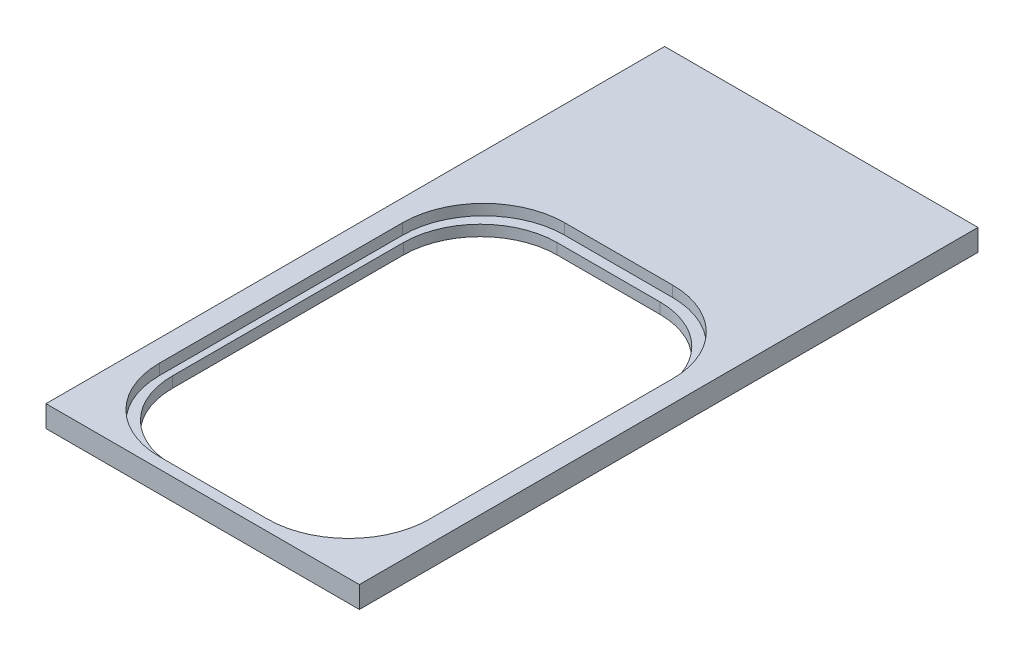
ISO-10303-21;
HEADER;
FILE_DESCRIPTION(('STEP AP214'),'2;1');
FILE_NAME('part.step','',(''),(''),'','','');
FILE_SCHEMA(('AUTOMOTIVE_DESIGN { 1 0 10303 214 1 1 1 1 }'));
ENDSEC;
DATA;
#1=APPLICATION_CONTEXT('core data for automotive mechanical design processes');
#2=APPLICATION_PROTOCOL_DEFINITION('international standard','automotive_design',2000,#1);
#3=PRODUCT_CONTEXT('',#1,'mechanical');
#4=PRODUCT('Part','Part','',(#3));
#5=PRODUCT_RELATED_PRODUCT_CATEGORY('part','',(#4));
#6=PRODUCT_DEFINITION_FORMATION('','',#4);
#7=PRODUCT_DEFINITION_CONTEXT('part definition',#1,'design');
#8=PRODUCT_DEFINITION('design','',#6,#7);
#9=PRODUCT_DEFINITION_SHAPE('','',#8);
#10=(LENGTH_UNIT() NAMED_UNIT(*) SI_UNIT(.MILLI.,.METRE.));
#11=(NAMED_UNIT(*) PLANE_ANGLE_UNIT() SI_UNIT($,.RADIAN.));
#12=(NAMED_UNIT(*) SI_UNIT($,.STERADIAN.) SOLID_ANGLE_UNIT());
#13=UNCERTAINTY_MEASURE_WITH_UNIT(LENGTH_MEASURE(1.E-05),#10,'distance_accuracy_value','');
#14=(GEOMETRIC_REPRESENTATION_CONTEXT(3) GLOBAL_UNCERTAINTY_ASSIGNED_CONTEXT((#13)) GLOBAL_UNIT_ASSIGNED_CONTEXT((#10,
#11,#12)) REPRESENTATION_CONTEXT('',''));
#15=CARTESIAN_POINT('',(0.,0.,0.));
#16=DIRECTION('',(0.,0.,1.));
#17=DIRECTION('',(1.,0.,0.));
#18=AXIS2_PLACEMENT_3D('',#15,#16,#17);
#19=CARTESIAN_POINT('',(-66.6066908635703,4.,36.3519764590724));
#20=DIRECTION('',(0.,0.,1.));
#21=DIRECTION('',(1.,0.,0.));
#22=AXIS2_PLACEMENT_3D('',#19,#20,#21);
#23=PLANE('',#22);
#24=DIRECTION('',(0.,-1.,0.));
#25=VECTOR('',#24,1.);
#26=CARTESIAN_POINT('',(-23.1066908635703,0.,36.3519764590724));
#27=LINE('',#26,#25);
#28=CARTESIAN_POINT('',(-23.1066908635703,4.,36.3519764590724));
#29=VERTEX_POINT('',#28);
#30=CARTESIAN_POINT('',(-23.1066908635703,0.,36.3519764590724));
#31=VERTEX_POINT('',#30);
#32=EDGE_CURVE('E185',#29,#31,#27,.T.);
#33=ORIENTED_EDGE('',*,*,#32,.F.);
#34=DIRECTION('',(1.,0.,0.));
#35=VECTOR('',#34,1.);
#36=CARTESIAN_POINT('',(0.,4.,36.3519764590724));
#37=LINE('',#36,#35);
#38=CARTESIAN_POINT('',(-81.1066908635703,4.,36.3519764590724));
#39=VERTEX_POINT('',#38);
#40=EDGE_CURVE('E173',#39,#29,#37,.T.);
#41=ORIENTED_EDGE('',*,*,#40,.F.);
#42=DIRECTION('',(0.,1.,0.));
#43=VECTOR('',#42,1.);
#44=CARTESIAN_POINT('',(-81.1066908635703,0.,36.3519764590724));
#45=LINE('',#44,#43);
#46=CARTESIAN_POINT('',(-81.1066908635703,0.,36.3519764590724));
#47=VERTEX_POINT('',#46);
#48=EDGE_CURVE('E182',#47,#39,#45,.T.);
#49=ORIENTED_EDGE('',*,*,#48,.F.);
#50=DIRECTION('',(1.,0.,0.));
#51=VECTOR('',#50,1.);
#52=CARTESIAN_POINT('',(0.,0.,36.3519764590724));
#53=LINE('',#52,#51);
#54=EDGE_CURVE('E187',#47,#31,#53,.T.);
#55=ORIENTED_EDGE('',*,*,#54,.T.);
#56=EDGE_LOOP('',(#33,#41,#49,#55));
#57=FACE_BOUND('',#56,.T.);
#58=ADVANCED_FACE('F37',(#57),#23,.T.);
#59=CARTESIAN_POINT('',(-62.1066908635703,2.,-25.6480235409276));
#60=DIRECTION('',(0.,-1.,0.));
#61=DIRECTION('',(0.,0.,-1.));
#62=AXIS2_PLACEMENT_3D('',#59,#60,#61);
#63=PLANE('',#62);
#64=CARTESIAN_POINT('',(-62.1066908635703,2.,-25.6480235409276));
#65=DIRECTION('',(0.,-1.,0.));
#66=DIRECTION('',(0.,0.,-1.));
#67=AXIS2_PLACEMENT_3D('',#64,#65,#66);
#68=CIRCLE('',#67,15.);
#69=CARTESIAN_POINT('',(-77.1066908635703,2.,-25.6480235409276));
#70=VERTEX_POINT('',#69);
#71=CARTESIAN_POINT('',(-62.1066908635703,2.,-40.6480235409276));
#72=VERTEX_POINT('',#71);
#73=EDGE_CURVE('E265',#70,#72,#68,.T.);
#74=ORIENTED_EDGE('',*,*,#73,.F.);
#75=DIRECTION('',(0.,0.,-1.));
#76=VECTOR('',#75,1.);
#77=CARTESIAN_POINT('',(-77.1066908635703,2.,19.3519764590724));
#78=LINE('',#77,#76);
#79=CARTESIAN_POINT('',(-77.1066908635703,2.,19.3519764590724));
#80=VERTEX_POINT('',#79);
#81=EDGE_CURVE('E281',#80,#70,#78,.T.);
#82=ORIENTED_EDGE('',*,*,#81,.F.);
#83=CARTESIAN_POINT('',(-62.1066908635703,2.,19.3519764590724));
#84=DIRECTION('',(0.,-1.,0.));
#85=DIRECTION('',(0.,0.,-1.));
#86=AXIS2_PLACEMENT_3D('',#83,#84,#85);
#87=CIRCLE('',#86,15.);
#88=CARTESIAN_POINT('',(-62.1066908635703,2.,34.3519764590724));
#89=VERTEX_POINT('',#88);
#90=EDGE_CURVE('E279',#89,#80,#87,.T.);
#91=ORIENTED_EDGE('',*,*,#90,.F.);
#92=DIRECTION('',(-1.,0.,0.));
#93=VECTOR('',#92,1.);
#94=CARTESIAN_POINT('',(-42.1066908635703,2.,34.3519764590724));
#95=LINE('',#94,#93);
#96=CARTESIAN_POINT('',(-42.1066908635703,2.,34.3519764590724));
#97=VERTEX_POINT('',#96);
#98=EDGE_CURVE('E277',#97,#89,#95,.T.);
#99=ORIENTED_EDGE('',*,*,#98,.F.);
#100=CARTESIAN_POINT('',(-42.1066908635703,2.,19.3519764590724));
#101=DIRECTION('',(0.,-1.,0.));
#102=DIRECTION('',(0.,0.,-1.));
#103=AXIS2_PLACEMENT_3D('',#100,#101,#102);
#104=CIRCLE('',#103,15.);
#105=CARTESIAN_POINT('',(-27.1066908635703,2.,19.3519764590724));
#106=VERTEX_POINT('',#105);
#107=EDGE_CURVE('E275',#106,#97,#104,.T.);
#108=ORIENTED_EDGE('',*,*,#107,.F.);
#109=DIRECTION('',(0.,0.,1.));
#110=VECTOR('',#109,1.);
#111=CARTESIAN_POINT('',(-27.1066908635703,2.,-25.6480235409276));
#112=LINE('',#111,#110);
#113=CARTESIAN_POINT('',(-27.1066908635703,2.,-25.6480235409276));
#114=VERTEX_POINT('',#113);
#115=EDGE_CURVE('E273',#114,#106,#112,.T.);
#116=ORIENTED_EDGE('',*,*,#115,.F.);
#117=CARTESIAN_POINT('',(-42.1066908635703,2.,-25.6480235409276));
#118=DIRECTION('',(0.,-1.,0.));
#119=DIRECTION('',(0.,0.,-1.));
#120=AXIS2_PLACEMENT_3D('',#117,#118,#119);
#121=CIRCLE('',#120,15.);
#122=CARTESIAN_POINT('',(-42.1066908635703,2.,-40.6480235409276));
#123=VERTEX_POINT('',#122);
#124=EDGE_CURVE('E271',#123,#114,#121,.T.);
#125=ORIENTED_EDGE('',*,*,#124,.F.);
#126=DIRECTION('',(1.,0.,0.));
#127=VECTOR('',#126,1.);
#128=CARTESIAN_POINT('',(-62.1066908635703,2.,-40.6480235409276));
#129=LINE('',#128,#127);
#130=EDGE_CURVE('E268',#72,#123,#129,.T.);
#131=ORIENTED_EDGE('',*,*,#130,.F.);
#132=EDGE_LOOP('',(#74,#82,#91,#99,#108,#116,#125,#131));
#133=FACE_BOUND('',#132,.T.);
#134=CARTESIAN_POINT('',(-61.6066904253846,2.,-24.5230235409276));
#135=DIRECTION('',(0.,-1.,0.));
#136=DIRECTION('',(0.,0.,-1.));
#137=AXIS2_PLACEMENT_3D('',#134,#135,#136);
#138=CIRCLE('',#137,14.25);
#139=CARTESIAN_POINT('',(-61.6066904253846,2.,-38.7730235409276));
#140=VERTEX_POINT('',#139);
#141=CARTESIAN_POINT('',(-75.8566904253846,2.,-24.5230235409276));
#142=VERTEX_POINT('',#141);
#143=EDGE_CURVE('E198',#140,#142,#138,.F.);
#144=ORIENTED_EDGE('',*,*,#143,.F.);
#145=DIRECTION('',(-1.,0.,0.));
#146=VECTOR('',#145,1.);
#147=CARTESIAN_POINT('',(-62.1066908635703,2.,-38.7730235409276));
#148=LINE('',#147,#146);
#149=CARTESIAN_POINT('',(-42.6066904253846,2.,-38.7730235409276));
#150=VERTEX_POINT('',#149);
#151=EDGE_CURVE('E201',#150,#140,#148,.T.);
#152=ORIENTED_EDGE('',*,*,#151,.F.);
#153=CARTESIAN_POINT('',(-42.6066904253846,2.,-24.5230235409276));
#154=DIRECTION('',(0.,-1.,0.));
#155=DIRECTION('',(0.,0.,-1.));
#156=AXIS2_PLACEMENT_3D('',#153,#154,#155);
#157=CIRCLE('',#156,14.25);
#158=CARTESIAN_POINT('',(-28.3566904253846,2.,-24.5230235409276));
#159=VERTEX_POINT('',#158);
#160=EDGE_CURVE('E208',#159,#150,#157,.F.);
#161=ORIENTED_EDGE('',*,*,#160,.F.);
#162=DIRECTION('',(0.,0.,-1.));
#163=VECTOR('',#162,1.);
#164=CARTESIAN_POINT('',(-28.3566904253846,2.,-25.6480235409276));
#165=LINE('',#164,#163);
#166=CARTESIAN_POINT('',(-28.3566904253846,2.,18.2269764590724));
#167=VERTEX_POINT('',#166);
#168=EDGE_CURVE('E326',#167,#159,#165,.T.);
#169=ORIENTED_EDGE('',*,*,#168,.F.);
#170=CARTESIAN_POINT('',(-42.6066904253846,2.,18.2269764590724));
#171=DIRECTION('',(0.,-1.,0.));
#172=DIRECTION('',(0.,0.,-1.));
#173=AXIS2_PLACEMENT_3D('',#170,#171,#172);
#174=CIRCLE('',#173,14.25);
#175=CARTESIAN_POINT('',(-42.6066904253846,2.,32.4769764590724));
#176=VERTEX_POINT('',#175);
#177=EDGE_CURVE('E324',#176,#167,#174,.F.);
#178=ORIENTED_EDGE('',*,*,#177,.F.);
#179=DIRECTION('',(1.,0.,0.));
#180=VECTOR('',#179,1.);
#181=CARTESIAN_POINT('',(-62.1066908635703,2.,32.4769764590724));
#182=LINE('',#181,#180);
#183=CARTESIAN_POINT('',(-61.6066904253846,2.,32.4769764590724));
#184=VERTEX_POINT('',#183);
#185=EDGE_CURVE('E322',#184,#176,#182,.T.);
#186=ORIENTED_EDGE('',*,*,#185,.F.);
#187=CARTESIAN_POINT('',(-61.6066904253846,2.,18.2269764590724));
#188=DIRECTION('',(0.,-1.,0.));
#189=DIRECTION('',(0.,0.,-1.));
#190=AXIS2_PLACEMENT_3D('',#187,#188,#189);
#191=CIRCLE('',#190,14.25);
#192=CARTESIAN_POINT('',(-75.8566904253846,2.,18.2269764590724));
#193=VERTEX_POINT('',#192);
#194=EDGE_CURVE('E320',#193,#184,#191,.F.);
#195=ORIENTED_EDGE('',*,*,#194,.F.);
#196=DIRECTION('',(0.,0.,1.));
#197=VECTOR('',#196,1.);
#198=CARTESIAN_POINT('',(-75.8566904253846,2.,-25.6480235409276));
#199=LINE('',#198,#197);
#200=EDGE_CURVE('E222',#142,#193,#199,.T.);
#201=ORIENTED_EDGE('',*,*,#200,.F.);
#202=EDGE_LOOP('',(#144,#152,#161,#169,#178,#186,#195,#201));
#203=FACE_BOUND('',#202,.T.);
#204=ADVANCED_FACE('F340',(#133,#203),#63,.F.);
#205=CARTESIAN_POINT('',(-61.6066904253846,-13.9294528165414,-38.7730235409276));
#206=DIRECTION('',(0.,0.,1.));
#207=DIRECTION('',(1.,0.,0.));
#208=AXIS2_PLACEMENT_3D('',#205,#206,#207);
#209=PLANE('',#208);
#210=DIRECTION('',(1.,0.,0.));
#211=VECTOR('',#210,1.);
#212=CARTESIAN_POINT('',(0.,0.,-38.7730235409276));
#213=LINE('',#212,#211);
#214=CARTESIAN_POINT('',(-61.6066904253846,0.,-38.7730235409276));
#215=VERTEX_POINT('',#214);
#216=CARTESIAN_POINT('',(-42.6066904253846,0.,-38.7730235409276));
#217=VERTEX_POINT('',#216);
#218=EDGE_CURVE('E260',#215,#217,#213,.T.);
#219=ORIENTED_EDGE('',*,*,#218,.T.);
#220=DIRECTION('',(0.,1.,0.));
#221=VECTOR('',#220,1.);
#222=CARTESIAN_POINT('',(-42.6066904253846,-13.9294528165414,-38.7730235409276));
#223=LINE('',#222,#221);
#224=EDGE_CURVE('E242',#217,#150,#223,.T.);
#225=ORIENTED_EDGE('',*,*,#224,.T.);
#226=ORIENTED_EDGE('',*,*,#151,.T.);
#227=DIRECTION('',(0.,1.,0.));
#228=VECTOR('',#227,1.);
#229=CARTESIAN_POINT('',(-61.6066904253846,-13.9294528165414,-38.7730235409276));
#230=LINE('',#229,#228);
#231=EDGE_CURVE('E245',#215,#140,#230,.T.);
#232=ORIENTED_EDGE('',*,*,#231,.F.);
#233=EDGE_LOOP('',(#219,#225,#226,#232));
#234=FACE_BOUND('',#233,.T.);
#235=ADVANCED_FACE('F337',(#234),#209,.T.);
#236=CARTESIAN_POINT('',(-42.6066904253846,-13.9294528165414,-24.5230235409276));
#237=DIRECTION('',(0.,1.,0.));
#238=DIRECTION('',(0.,0.,1.));
#239=AXIS2_PLACEMENT_3D('',#236,#237,#238);
#240=CYLINDRICAL_SURFACE('',#239,14.25);
#241=CARTESIAN_POINT('',(-42.6066904253846,0.,-24.5230235409276));
#242=DIRECTION('',(0.,1.,0.));
#243=DIRECTION('',(0.,0.,1.));
#244=AXIS2_PLACEMENT_3D('',#241,#242,#243);
#245=CIRCLE('',#244,14.25);
#246=CARTESIAN_POINT('',(-28.3566904253846,0.,-24.5230235409276));
#247=VERTEX_POINT('',#246);
#248=EDGE_CURVE('E258',#217,#247,#245,.F.);
#249=ORIENTED_EDGE('',*,*,#248,.T.);
#250=DIRECTION('',(0.,1.,0.));
#251=VECTOR('',#250,1.);
#252=CARTESIAN_POINT('',(-28.3566904253846,-13.9294528165414,-24.5230235409276));
#253=LINE('',#252,#251);
#254=EDGE_CURVE('E239',#247,#159,#253,.T.);
#255=ORIENTED_EDGE('',*,*,#254,.T.);
#256=ORIENTED_EDGE('',*,*,#160,.T.);
#257=ORIENTED_EDGE('',*,*,#224,.F.);
#258=EDGE_LOOP('',(#249,#255,#256,#257));
#259=FACE_BOUND('',#258,.T.);
#260=ADVANCED_FACE('F330',(#259),#240,.F.);
#261=CARTESIAN_POINT('',(-28.3566904253846,-13.9294528165414,-24.5230235409276));
#262=DIRECTION('',(-1.,0.,0.));
#263=DIRECTION('',(0.,0.,1.));
#264=AXIS2_PLACEMENT_3D('',#261,#262,#263);
#265=PLANE('',#264);
#266=DIRECTION('',(0.,0.,1.));
#267=VECTOR('',#266,1.);
#268=CARTESIAN_POINT('',(-28.3566904253846,0.,0.));
#269=LINE('',#268,#267);
#270=CARTESIAN_POINT('',(-28.3566904253846,0.,18.2269764590724));
#271=VERTEX_POINT('',#270);
#272=EDGE_CURVE('E256',#247,#271,#269,.T.);
#273=ORIENTED_EDGE('',*,*,#272,.T.);
#274=DIRECTION('',(0.,1.,0.));
#275=VECTOR('',#274,1.);
#276=CARTESIAN_POINT('',(-28.3566904253846,-13.9294528165414,18.2269764590724));
#277=LINE('',#276,#275);
#278=EDGE_CURVE('E236',#271,#167,#277,.T.);
#279=ORIENTED_EDGE('',*,*,#278,.T.);
#280=ORIENTED_EDGE('',*,*,#168,.T.);
#281=ORIENTED_EDGE('',*,*,#254,.F.);
#282=EDGE_LOOP('',(#273,#279,#280,#281));
#283=FACE_BOUND('',#282,.T.);
#284=ADVANCED_FACE('F357',(#283),#265,.T.);
#285=CARTESIAN_POINT('',(-42.6066904253846,-13.9294528165414,18.2269764590724));
#286=DIRECTION('',(0.,1.,0.));
#287=DIRECTION('',(0.,0.,1.));
#288=AXIS2_PLACEMENT_3D('',#285,#286,#287);
#289=CYLINDRICAL_SURFACE('',#288,14.25);
#290=CARTESIAN_POINT('',(-42.6066904253846,0.,18.2269764590724));
#291=DIRECTION('',(0.,1.,0.));
#292=DIRECTION('',(0.,0.,1.));
#293=AXIS2_PLACEMENT_3D('',#290,#291,#292);
#294=CIRCLE('',#293,14.25);
#295=CARTESIAN_POINT('',(-42.6066904253846,0.,32.4769764590724));
#296=VERTEX_POINT('',#295);
#297=EDGE_CURVE('E254',#271,#296,#294,.F.);
#298=ORIENTED_EDGE('',*,*,#297,.T.);
#299=DIRECTION('',(0.,1.,0.));
#300=VECTOR('',#299,1.);
#301=CARTESIAN_POINT('',(-42.6066904253846,-13.9294528165414,32.4769764590724));
#302=LINE('',#301,#300);
#303=EDGE_CURVE('E233',#296,#176,#302,.T.);
#304=ORIENTED_EDGE('',*,*,#303,.T.);
#305=ORIENTED_EDGE('',*,*,#177,.T.);
#306=ORIENTED_EDGE('',*,*,#278,.F.);
#307=EDGE_LOOP('',(#298,#304,#305,#306));
#308=FACE_BOUND('',#307,.T.);
#309=ADVANCED_FACE('F361',(#308),#289,.F.);
#310=CARTESIAN_POINT('',(-42.6066904253846,-13.9294528165414,32.4769764590724));
#311=DIRECTION('',(0.,0.,-1.));
#312=DIRECTION('',(-1.,0.,0.));
#313=AXIS2_PLACEMENT_3D('',#310,#311,#312);
#314=PLANE('',#313);
#315=DIRECTION('',(-1.,0.,0.));
#316=VECTOR('',#315,1.);
#317=CARTESIAN_POINT('',(0.,0.,32.4769764590724));
#318=LINE('',#317,#316);
#319=CARTESIAN_POINT('',(-61.6066904253846,0.,32.4769764590724));
#320=VERTEX_POINT('',#319);
#321=EDGE_CURVE('E252',#296,#320,#318,.T.);
#322=ORIENTED_EDGE('',*,*,#321,.T.);
#323=DIRECTION('',(0.,1.,0.));
#324=VECTOR('',#323,1.);
#325=CARTESIAN_POINT('',(-61.6066904253846,-13.9294528165414,32.4769764590724));
#326=LINE('',#325,#324);
#327=EDGE_CURVE('E230',#320,#184,#326,.T.);
#328=ORIENTED_EDGE('',*,*,#327,.T.);
#329=ORIENTED_EDGE('',*,*,#185,.T.);
#330=ORIENTED_EDGE('',*,*,#303,.F.);
#331=EDGE_LOOP('',(#322,#328,#329,#330));
#332=FACE_BOUND('',#331,.T.);
#333=ADVANCED_FACE('F364',(#332),#314,.T.);
#334=CARTESIAN_POINT('',(-61.6066904253846,-13.9294528165414,18.2269764590724));
#335=DIRECTION('',(0.,1.,0.));
#336=DIRECTION('',(0.,0.,1.));
#337=AXIS2_PLACEMENT_3D('',#334,#335,#336);
#338=CYLINDRICAL_SURFACE('',#337,14.25);
#339=CARTESIAN_POINT('',(-61.6066904253846,0.,18.2269764590724));
#340=DIRECTION('',(0.,1.,0.));
#341=DIRECTION('',(0.,0.,1.));
#342=AXIS2_PLACEMENT_3D('',#339,#340,#341);
#343=CIRCLE('',#342,14.25);
#344=CARTESIAN_POINT('',(-75.8566904253846,0.,18.2269764590724));
#345=VERTEX_POINT('',#344);
#346=EDGE_CURVE('E249',#320,#345,#343,.F.);
#347=ORIENTED_EDGE('',*,*,#346,.T.);
#348=DIRECTION('',(0.,1.,0.));
#349=VECTOR('',#348,1.);
#350=CARTESIAN_POINT('',(-75.8566904253846,-13.9294528165414,18.2269764590724));
#351=LINE('',#350,#349);
#352=EDGE_CURVE('E192',#345,#193,#351,.T.);
#353=ORIENTED_EDGE('',*,*,#352,.T.);
#354=ORIENTED_EDGE('',*,*,#194,.T.);
#355=ORIENTED_EDGE('',*,*,#327,.F.);
#356=EDGE_LOOP('',(#347,#353,#354,#355));
#357=FACE_BOUND('',#356,.T.);
#358=ADVANCED_FACE('F346',(#357),#338,.F.);
#359=CARTESIAN_POINT('',(-75.8566904253846,-13.9294528165414,18.2269764590724));
#360=DIRECTION('',(1.,0.,0.));
#361=DIRECTION('',(0.,0.,-1.));
#362=AXIS2_PLACEMENT_3D('',#359,#360,#361);
#363=PLANE('',#362);
#364=DIRECTION('',(0.,0.,-1.));
#365=VECTOR('',#364,1.);
#366=CARTESIAN_POINT('',(-75.8566904253846,0.,0.));
#367=LINE('',#366,#365);
#368=CARTESIAN_POINT('',(-75.8566904253846,0.,-24.5230235409276));
#369=VERTEX_POINT('',#368);
#370=EDGE_CURVE('E247',#345,#369,#367,.T.);
#371=ORIENTED_EDGE('',*,*,#370,.T.);
#372=DIRECTION('',(0.,1.,0.));
#373=VECTOR('',#372,1.);
#374=CARTESIAN_POINT('',(-75.8566904253846,-13.9294528165414,-24.5230235409276));
#375=LINE('',#374,#373);
#376=EDGE_CURVE('E190',#369,#142,#375,.T.);
#377=ORIENTED_EDGE('',*,*,#376,.T.);
#378=ORIENTED_EDGE('',*,*,#200,.T.);
#379=ORIENTED_EDGE('',*,*,#352,.F.);
#380=EDGE_LOOP('',(#371,#377,#378,#379));
#381=FACE_BOUND('',#380,.T.);
#382=ADVANCED_FACE('F344',(#381),#363,.T.);
#383=CARTESIAN_POINT('',(-61.6066904253846,-13.9294528165414,-24.5230235409276));
#384=DIRECTION('',(0.,1.,0.));
#385=DIRECTION('',(0.,0.,1.));
#386=AXIS2_PLACEMENT_3D('',#383,#384,#385);
#387=CYLINDRICAL_SURFACE('',#386,14.25);
#388=CARTESIAN_POINT('',(-61.6066904253846,0.,-24.5230235409276));
#389=DIRECTION('',(0.,1.,0.));
#390=DIRECTION('',(0.,0.,1.));
#391=AXIS2_PLACEMENT_3D('',#388,#389,#390);
#392=CIRCLE('',#391,14.25);
#393=EDGE_CURVE('E262',#369,#215,#392,.F.);
#394=ORIENTED_EDGE('',*,*,#393,.T.);
#395=ORIENTED_EDGE('',*,*,#231,.T.);
#396=ORIENTED_EDGE('',*,*,#143,.T.);
#397=ORIENTED_EDGE('',*,*,#376,.F.);
#398=EDGE_LOOP('',(#394,#395,#396,#397));
#399=FACE_BOUND('',#398,.T.);
#400=ADVANCED_FACE('F353',(#399),#387,.F.);
#401=CARTESIAN_POINT('',(-23.1066908635703,0.,0.));
#402=DIRECTION('',(1.,0.,0.));
#403=DIRECTION('',(0.,0.,-1.));
#404=AXIS2_PLACEMENT_3D('',#401,#402,#403);
#405=PLANE('',#404);
#406=DIRECTION('',(0.,0.,1.));
#407=VECTOR('',#406,1.);
#408=CARTESIAN_POINT('',(-23.1066908635703,4.,-78.1480235409276));
#409=LINE('',#408,#407);
#410=CARTESIAN_POINT('',(-23.1066908635703,4.,-78.1480235409276));
#411=VERTEX_POINT('',#410);
#412=EDGE_CURVE('E178',#411,#29,#409,.T.);
#413=ORIENTED_EDGE('',*,*,#412,.T.);
#414=ORIENTED_EDGE('',*,*,#32,.T.);
#415=DIRECTION('',(0.,0.,-1.));
#416=VECTOR('',#415,1.);
#417=CARTESIAN_POINT('',(-23.1066908635703,0.,71.8519764590724));
#418=LINE('',#417,#416);
#419=CARTESIAN_POINT('',(-23.1066908635703,0.,-78.1480235409276));
#420=VERTEX_POINT('',#419);
#421=EDGE_CURVE('E58',#31,#420,#418,.T.);
#422=ORIENTED_EDGE('',*,*,#421,.T.);
#423=DIRECTION('',(0.,1.,0.));
#424=VECTOR('',#423,1.);
#425=CARTESIAN_POINT('',(-23.1066908635703,0.,-78.1480235409276));
#426=LINE('',#425,#424);
#427=EDGE_CURVE('E189',#420,#411,#426,.T.);
#428=ORIENTED_EDGE('',*,*,#427,.T.);
#429=EDGE_LOOP('',(#413,#414,#422,#428));
#430=FACE_BOUND('',#429,.T.);
#431=ADVANCED_FACE('F39',(#430),#405,.T.);
#432=CARTESIAN_POINT('',(-62.1066908635703,2.,19.3519764590724));
#433=DIRECTION('',(0.,1.,0.));
#434=DIRECTION('',(0.,0.,1.));
#435=AXIS2_PLACEMENT_3D('',#432,#433,#434);
#436=CYLINDRICAL_SURFACE('',#435,15.);
#437=CARTESIAN_POINT('',(-62.1066908635703,4.,19.3519764590724));
#438=DIRECTION('',(0.,-1.,0.));
#439=DIRECTION('',(0.,0.,-1.));
#440=AXIS2_PLACEMENT_3D('',#437,#438,#439);
#441=CIRCLE('',#440,15.);
#442=CARTESIAN_POINT('',(-62.1066908635703,4.,34.3519764590724));
#443=VERTEX_POINT('',#442);
#444=CARTESIAN_POINT('',(-77.1066908635703,4.,19.3519764590724));
#445=VERTEX_POINT('',#444);
#446=EDGE_CURVE('E301',#443,#445,#441,.T.);
#447=ORIENTED_EDGE('',*,*,#446,.F.);
#448=DIRECTION('',(0.,1.,0.));
#449=VECTOR('',#448,1.);
#450=CARTESIAN_POINT('',(-62.1066908635703,2.,34.3519764590724));
#451=LINE('',#450,#449);
#452=EDGE_CURVE('E310',#89,#443,#451,.T.);
#453=ORIENTED_EDGE('',*,*,#452,.F.);
#454=ORIENTED_EDGE('',*,*,#90,.T.);
#455=DIRECTION('',(0.,1.,0.));
#456=VECTOR('',#455,1.);
#457=CARTESIAN_POINT('',(-77.1066908635703,2.,19.3519764590724));
#458=LINE('',#457,#456);
#459=EDGE_CURVE('E308',#80,#445,#458,.T.);
#460=ORIENTED_EDGE('',*,*,#459,.T.);
#461=EDGE_LOOP('',(#447,#453,#454,#460));
#462=FACE_BOUND('',#461,.T.);
#463=ADVANCED_FACE('F391',(#462),#436,.F.);
#464=CARTESIAN_POINT('',(-42.1066908635703,2.,34.3519764590724));
#465=DIRECTION('',(0.,0.,-1.));
#466=DIRECTION('',(-1.,0.,0.));
#467=AXIS2_PLACEMENT_3D('',#464,#465,#466);
#468=PLANE('',#467);
#469=DIRECTION('',(-1.,0.,0.));
#470=VECTOR('',#469,1.);
#471=CARTESIAN_POINT('',(-42.1066908635703,4.,34.3519764590724));
#472=LINE('',#471,#470);
#473=CARTESIAN_POINT('',(-42.1066908635703,4.,34.3519764590724));
#474=VERTEX_POINT('',#473);
#475=EDGE_CURVE('E298',#474,#443,#472,.T.);
#476=ORIENTED_EDGE('',*,*,#475,.F.);
#477=DIRECTION('',(0.,1.,0.));
#478=VECTOR('',#477,1.);
#479=CARTESIAN_POINT('',(-42.1066908635703,2.,34.3519764590724));
#480=LINE('',#479,#478);
#481=EDGE_CURVE('E312',#97,#474,#480,.T.);
#482=ORIENTED_EDGE('',*,*,#481,.F.);
#483=ORIENTED_EDGE('',*,*,#98,.T.);
#484=ORIENTED_EDGE('',*,*,#452,.T.);
#485=EDGE_LOOP('',(#476,#482,#483,#484));
#486=FACE_BOUND('',#485,.T.);
#487=ADVANCED_FACE('F394',(#486),#468,.T.);
#488=CARTESIAN_POINT('',(-42.1066908635703,2.,19.3519764590724));
#489=DIRECTION('',(0.,1.,0.));
#490=DIRECTION('',(0.,0.,1.));
#491=AXIS2_PLACEMENT_3D('',#488,#489,#490);
#492=CYLINDRICAL_SURFACE('',#491,15.);
#493=CARTESIAN_POINT('',(-42.1066908635703,4.,19.3519764590724));
#494=DIRECTION('',(0.,-1.,0.));
#495=DIRECTION('',(0.,0.,-1.));
#496=AXIS2_PLACEMENT_3D('',#493,#494,#495);
#497=CIRCLE('',#496,15.);
#498=CARTESIAN_POINT('',(-27.1066908635703,4.,19.3519764590724));
#499=VERTEX_POINT('',#498);
#500=EDGE_CURVE('E295',#499,#474,#497,.T.);
#501=ORIENTED_EDGE('',*,*,#500,.F.);
#502=DIRECTION('',(0.,1.,0.));
#503=VECTOR('',#502,1.);
#504=CARTESIAN_POINT('',(-27.1066908635703,2.,19.3519764590724));
#505=LINE('',#504,#503);
#506=EDGE_CURVE('E314',#106,#499,#505,.T.);
#507=ORIENTED_EDGE('',*,*,#506,.F.);
#508=ORIENTED_EDGE('',*,*,#107,.T.);
#509=ORIENTED_EDGE('',*,*,#481,.T.);
#510=EDGE_LOOP('',(#501,#507,#508,#509));
#511=FACE_BOUND('',#510,.T.);
#512=ADVANCED_FACE('F398',(#511),#492,.F.);
#513=CARTESIAN_POINT('',(-27.1066908635703,2.,-25.6480235409276));
#514=DIRECTION('',(-1.,0.,0.));
#515=DIRECTION('',(0.,0.,1.));
#516=AXIS2_PLACEMENT_3D('',#513,#514,#515);
#517=PLANE('',#516);
#518=DIRECTION('',(0.,0.,1.));
#519=VECTOR('',#518,1.);
#520=CARTESIAN_POINT('',(-27.1066908635703,4.,-25.6480235409276));
#521=LINE('',#520,#519);
#522=CARTESIAN_POINT('',(-27.1066908635703,4.,-25.6480235409276));
#523=VERTEX_POINT('',#522);
#524=EDGE_CURVE('E292',#523,#499,#521,.T.);
#525=ORIENTED_EDGE('',*,*,#524,.F.);
#526=DIRECTION('',(0.,1.,0.));
#527=VECTOR('',#526,1.);
#528=CARTESIAN_POINT('',(-27.1066908635703,2.,-25.6480235409276));
#529=LINE('',#528,#527);
#530=EDGE_CURVE('E316',#114,#523,#529,.T.);
#531=ORIENTED_EDGE('',*,*,#530,.F.);
#532=ORIENTED_EDGE('',*,*,#115,.T.);
#533=ORIENTED_EDGE('',*,*,#506,.T.);
#534=EDGE_LOOP('',(#525,#531,#532,#533));
#535=FACE_BOUND('',#534,.T.);
#536=ADVANCED_FACE('F402',(#535),#517,.T.);
#537=CARTESIAN_POINT('',(-42.1066908635703,2.,-25.6480235409276));
#538=DIRECTION('',(0.,1.,0.));
#539=DIRECTION('',(0.,0.,1.));
#540=AXIS2_PLACEMENT_3D('',#537,#538,#539);
#541=CYLINDRICAL_SURFACE('',#540,15.);
#542=CARTESIAN_POINT('',(-42.1066908635703,4.,-25.6480235409276));
#543=DIRECTION('',(0.,-1.,0.));
#544=DIRECTION('',(0.,0.,-1.));
#545=AXIS2_PLACEMENT_3D('',#542,#543,#544);
#546=CIRCLE('',#545,15.);
#547=CARTESIAN_POINT('',(-42.1066908635703,4.,-40.6480235409276));
#548=VERTEX_POINT('',#547);
#549=EDGE_CURVE('E289',#548,#523,#546,.T.);
#550=ORIENTED_EDGE('',*,*,#549,.F.);
#551=DIRECTION('',(0.,1.,0.));
#552=VECTOR('',#551,1.);
#553=CARTESIAN_POINT('',(-42.1066908635703,2.,-40.6480235409276));
#554=LINE('',#553,#552);
#555=EDGE_CURVE('E225',#123,#548,#554,.T.);
#556=ORIENTED_EDGE('',*,*,#555,.F.);
#557=ORIENTED_EDGE('',*,*,#124,.T.);
#558=ORIENTED_EDGE('',*,*,#530,.T.);
#559=EDGE_LOOP('',(#550,#556,#557,#558));
#560=FACE_BOUND('',#559,.T.);
#561=ADVANCED_FACE('F406',(#560),#541,.F.);
#562=CARTESIAN_POINT('',(-62.1066908635703,2.,-40.6480235409276));
#563=DIRECTION('',(0.,0.,1.));
#564=DIRECTION('',(1.,0.,0.));
#565=AXIS2_PLACEMENT_3D('',#562,#563,#564);
#566=PLANE('',#565);
#567=DIRECTION('',(1.,0.,0.));
#568=VECTOR('',#567,1.);
#569=CARTESIAN_POINT('',(-62.1066908635703,4.,-40.6480235409276));
#570=LINE('',#569,#568);
#571=CARTESIAN_POINT('',(-62.1066908635703,4.,-40.6480235409276));
#572=VERTEX_POINT('',#571);
#573=EDGE_CURVE('E286',#572,#548,#570,.T.);
#574=ORIENTED_EDGE('',*,*,#573,.F.);
#575=DIRECTION('',(0.,1.,0.));
#576=VECTOR('',#575,1.);
#577=CARTESIAN_POINT('',(-62.1066908635703,2.,-40.6480235409276));
#578=LINE('',#577,#576);
#579=EDGE_CURVE('E220',#72,#572,#578,.T.);
#580=ORIENTED_EDGE('',*,*,#579,.F.);
#581=ORIENTED_EDGE('',*,*,#130,.T.);
#582=ORIENTED_EDGE('',*,*,#555,.T.);
#583=EDGE_LOOP('',(#574,#580,#581,#582));
#584=FACE_BOUND('',#583,.T.);
#585=ADVANCED_FACE('F410',(#584),#566,.T.);
#586=CARTESIAN_POINT('',(-62.1066908635703,2.,-25.6480235409276));
#587=DIRECTION('',(0.,1.,0.));
#588=DIRECTION('',(0.,0.,1.));
#589=AXIS2_PLACEMENT_3D('',#586,#587,#588);
#590=CYLINDRICAL_SURFACE('',#589,15.);
#591=CARTESIAN_POINT('',(-62.1066908635703,4.,-25.6480235409276));
#592=DIRECTION('',(0.,-1.,0.));
#593=DIRECTION('',(0.,0.,-1.));
#594=AXIS2_PLACEMENT_3D('',#591,#592,#593);
#595=CIRCLE('',#594,15.);
#596=CARTESIAN_POINT('',(-77.1066908635703,4.,-25.6480235409276));
#597=VERTEX_POINT('',#596);
#598=EDGE_CURVE('E264',#597,#572,#595,.T.);
#599=ORIENTED_EDGE('',*,*,#598,.F.);
#600=DIRECTION('',(0.,1.,0.));
#601=VECTOR('',#600,1.);
#602=CARTESIAN_POINT('',(-77.1066908635703,2.,-25.6480235409276));
#603=LINE('',#602,#601);
#604=EDGE_CURVE('E283',#70,#597,#603,.T.);
#605=ORIENTED_EDGE('',*,*,#604,.F.);
#606=ORIENTED_EDGE('',*,*,#73,.T.);
#607=ORIENTED_EDGE('',*,*,#579,.T.);
#608=EDGE_LOOP('',(#599,#605,#606,#607));
#609=FACE_BOUND('',#608,.T.);
#610=ADVANCED_FACE('F389',(#609),#590,.F.);
#611=CARTESIAN_POINT('',(-77.1066908635703,2.,19.3519764590724));
#612=DIRECTION('',(1.,0.,0.));
#613=DIRECTION('',(0.,0.,-1.));
#614=AXIS2_PLACEMENT_3D('',#611,#612,#613);
#615=PLANE('',#614);
#616=DIRECTION('',(0.,0.,-1.));
#617=VECTOR('',#616,1.);
#618=CARTESIAN_POINT('',(-77.1066908635703,4.,19.3519764590724));
#619=LINE('',#618,#617);
#620=EDGE_CURVE('E269',#445,#597,#619,.T.);
#621=ORIENTED_EDGE('',*,*,#620,.F.);
#622=ORIENTED_EDGE('',*,*,#459,.F.);
#623=ORIENTED_EDGE('',*,*,#81,.T.);
#624=ORIENTED_EDGE('',*,*,#604,.T.);
#625=EDGE_LOOP('',(#621,#622,#623,#624));
#626=FACE_BOUND('',#625,.T.);
#627=ADVANCED_FACE('F385',(#626),#615,.T.);
#628=CARTESIAN_POINT('',(-127.10669086357,4.,-78.1480235409276));
#629=DIRECTION('',(0.,0.,1.));
#630=DIRECTION('',(1.,0.,0.));
#631=AXIS2_PLACEMENT_3D('',#628,#629,#630);
#632=PLANE('',#631);
#633=DIRECTION('',(0.,-1.,0.));
#634=VECTOR('',#633,1.);
#635=CARTESIAN_POINT('',(-81.1066908635703,4.,-78.1480235409276));
#636=LINE('',#635,#634);
#637=CARTESIAN_POINT('',(-81.1066908635703,4.,-78.1480235409276));
#638=VERTEX_POINT('',#637);
#639=CARTESIAN_POINT('',(-81.1066908635703,0.,-78.1480235409276));
#640=VERTEX_POINT('',#639);
#641=EDGE_CURVE('E45',#638,#640,#636,.T.);
#642=ORIENTED_EDGE('',*,*,#641,.F.);
#643=DIRECTION('',(-1.,0.,0.));
#644=VECTOR('',#643,1.);
#645=CARTESIAN_POINT('',(-127.10669086357,4.,-78.1480235409276));
#646=LINE('',#645,#644);
#647=EDGE_CURVE('E219',#411,#638,#646,.T.);
#648=ORIENTED_EDGE('',*,*,#647,.F.);
#649=ORIENTED_EDGE('',*,*,#427,.F.);
#650=DIRECTION('',(-1.,0.,0.));
#651=VECTOR('',#650,1.);
#652=CARTESIAN_POINT('',(-127.10669086357,0.,-78.1480235409276));
#653=LINE('',#652,#651);
#654=EDGE_CURVE('E217',#420,#640,#653,.T.);
#655=ORIENTED_EDGE('',*,*,#654,.T.);
#656=EDGE_LOOP('',(#642,#648,#649,#655));
#657=FACE_BOUND('',#656,.T.);
#658=ADVANCED_FACE('F388',(#657),#632,.F.);
#659=CARTESIAN_POINT('',(0.,4.,0.));
#660=DIRECTION('',(0.,1.,0.));
#661=DIRECTION('',(0.,0.,1.));
#662=AXIS2_PLACEMENT_3D('',#659,#660,#661);
#663=PLANE('',#662);
#664=ORIENTED_EDGE('',*,*,#620,.T.);
#665=ORIENTED_EDGE('',*,*,#598,.T.);
#666=ORIENTED_EDGE('',*,*,#573,.T.);
#667=ORIENTED_EDGE('',*,*,#549,.T.);
#668=ORIENTED_EDGE('',*,*,#524,.T.);
#669=ORIENTED_EDGE('',*,*,#500,.T.);
#670=ORIENTED_EDGE('',*,*,#475,.T.);
#671=ORIENTED_EDGE('',*,*,#446,.T.);
#672=EDGE_LOOP('',(#664,#665,#666,#667,#668,#669,#670,#671));
#673=FACE_BOUND('',#672,.T.);
#674=DIRECTION('',(0.,0.,-1.));
#675=VECTOR('',#674,1.);
#676=CARTESIAN_POINT('',(-81.1066908635703,4.,71.8519764590724));
#677=LINE('',#676,#675);
#678=EDGE_CURVE('E11',#39,#638,#677,.T.);
#679=ORIENTED_EDGE('',*,*,#678,.F.);
#680=ORIENTED_EDGE('',*,*,#40,.T.);
#681=ORIENTED_EDGE('',*,*,#412,.F.);
#682=ORIENTED_EDGE('',*,*,#647,.T.);
#683=EDGE_LOOP('',(#679,#680,#681,#682));
#684=FACE_BOUND('',#683,.T.);
#685=ADVANCED_FACE('F175',(#673,#684),#663,.T.);
#686=CARTESIAN_POINT('',(0.,0.,0.));
#687=DIRECTION('',(0.,1.,0.));
#688=DIRECTION('',(0.,0.,1.));
#689=AXIS2_PLACEMENT_3D('',#686,#687,#688);
#690=PLANE('',#689);
#691=ORIENTED_EDGE('',*,*,#393,.F.);
#692=ORIENTED_EDGE('',*,*,#370,.F.);
#693=ORIENTED_EDGE('',*,*,#346,.F.);
#694=ORIENTED_EDGE('',*,*,#321,.F.);
#695=ORIENTED_EDGE('',*,*,#297,.F.);
#696=ORIENTED_EDGE('',*,*,#272,.F.);
#697=ORIENTED_EDGE('',*,*,#248,.F.);
#698=ORIENTED_EDGE('',*,*,#218,.F.);
#699=EDGE_LOOP('',(#691,#692,#693,#694,#695,#696,#697,#698));
#700=FACE_BOUND('',#699,.T.);
#701=ORIENTED_EDGE('',*,*,#54,.F.);
#702=DIRECTION('',(0.,0.,1.));
#703=VECTOR('',#702,1.);
#704=CARTESIAN_POINT('',(-81.1066908635703,0.,-78.1480235409276));
#705=LINE('',#704,#703);
#706=EDGE_CURVE('E197',#640,#47,#705,.T.);
#707=ORIENTED_EDGE('',*,*,#706,.F.);
#708=ORIENTED_EDGE('',*,*,#654,.F.);
#709=ORIENTED_EDGE('',*,*,#421,.F.);
#710=EDGE_LOOP('',(#701,#707,#708,#709));
#711=FACE_BOUND('',#710,.T.);
#712=ADVANCED_FACE('F214',(#700,#711),#690,.F.);
#713=CARTESIAN_POINT('',(-81.1066908635703,0.,0.));
#714=DIRECTION('',(-1.,0.,0.));
#715=DIRECTION('',(0.,0.,1.));
#716=AXIS2_PLACEMENT_3D('',#713,#714,#715);
#717=PLANE('',#716);
#718=ORIENTED_EDGE('',*,*,#706,.T.);
#719=ORIENTED_EDGE('',*,*,#48,.T.);
#720=ORIENTED_EDGE('',*,*,#678,.T.);
#721=ORIENTED_EDGE('',*,*,#641,.T.);
#722=EDGE_LOOP('',(#718,#719,#720,#721));
#723=FACE_BOUND('',#722,.T.);
#724=ADVANCED_FACE('F212',(#723),#717,.T.);
#725=CLOSED_SHELL('',(#58,#204,#235,#260,#284,#309,#333,#358,#382,#400,#431,#463,#487,#512,#536,
#561,#585,#610,#627,#658,#685,#712,#724));
#726=MANIFOLD_SOLID_BREP('B2',#725);
#727=ADVANCED_BREP_SHAPE_REPRESENTATION('',(#18,#726),#14);
#728=SHAPE_DEFINITION_REPRESENTATION(#9,#727);
ENDSEC;
END-ISO-10303-21;
